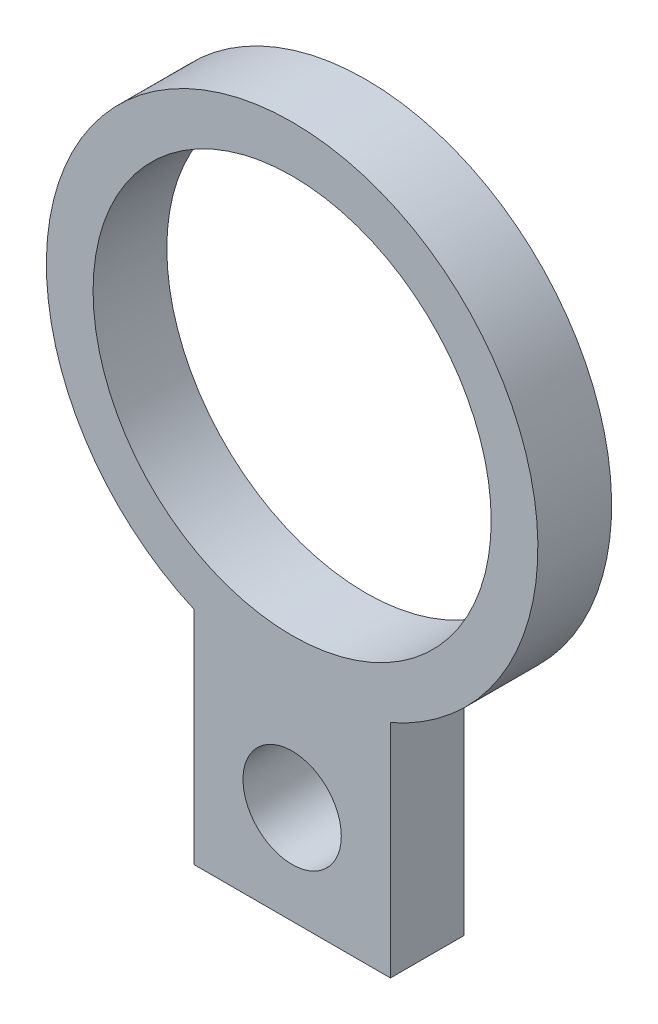
ISO-10303-21;
HEADER;
FILE_DESCRIPTION(('STEP AP214'),'2;1');
FILE_NAME('part.step','',(''),(''),'','','');
FILE_SCHEMA(('AUTOMOTIVE_DESIGN { 1 0 10303 214 1 1 1 1 }'));
ENDSEC;
DATA;
#1=APPLICATION_CONTEXT('core data for automotive mechanical design processes');
#2=APPLICATION_PROTOCOL_DEFINITION('international standard','automotive_design',2000,#1);
#3=PRODUCT_CONTEXT('',#1,'mechanical');
#4=PRODUCT('Part','Part','',(#3));
#5=PRODUCT_RELATED_PRODUCT_CATEGORY('part','',(#4));
#6=PRODUCT_DEFINITION_FORMATION('','',#4);
#7=PRODUCT_DEFINITION_CONTEXT('part definition',#1,'design');
#8=PRODUCT_DEFINITION('design','',#6,#7);
#9=PRODUCT_DEFINITION_SHAPE('','',#8);
#10=(LENGTH_UNIT() NAMED_UNIT(*) SI_UNIT(.MILLI.,.METRE.));
#11=(NAMED_UNIT(*) PLANE_ANGLE_UNIT() SI_UNIT($,.RADIAN.));
#12=(NAMED_UNIT(*) SI_UNIT($,.STERADIAN.) SOLID_ANGLE_UNIT());
#13=UNCERTAINTY_MEASURE_WITH_UNIT(LENGTH_MEASURE(1.E-05),#10,'distance_accuracy_value','');
#14=(GEOMETRIC_REPRESENTATION_CONTEXT(3) GLOBAL_UNCERTAINTY_ASSIGNED_CONTEXT((#13)) GLOBAL_UNIT_ASSIGNED_CONTEXT((#10,
#11,#12)) REPRESENTATION_CONTEXT('',''));
#15=CARTESIAN_POINT('',(0.,0.,0.));
#16=DIRECTION('',(0.,0.,1.));
#17=DIRECTION('',(1.,0.,0.));
#18=AXIS2_PLACEMENT_3D('',#15,#16,#17);
#19=CARTESIAN_POINT('',(0.,0.,1.5));
#20=DIRECTION('',(0.,0.,1.));
#21=DIRECTION('',(1.,0.,0.));
#22=AXIS2_PLACEMENT_3D('',#19,#20,#21);
#23=PLANE('',#22);
#24=CARTESIAN_POINT('',(0.,0.,1.5));
#25=DIRECTION('',(0.,0.,1.));
#26=DIRECTION('',(1.,0.,0.));
#27=AXIS2_PLACEMENT_3D('',#24,#25,#26);
#28=CIRCLE('',#27,4.05);
#29=CARTESIAN_POINT('',(4.05,0.,1.5));
#30=VERTEX_POINT('',#29);
#31=EDGE_CURVE('E112',#30,#30,#28,.T.);
#32=ORIENTED_EDGE('',*,*,#31,.F.);
#33=EDGE_LOOP('',(#32));
#34=FACE_BOUND('',#33,.T.);
#35=DIRECTION('',(0.,1.,0.));
#36=VECTOR('',#35,1.);
#37=CARTESIAN_POINT('',(2.,-9.08257569495584,1.5));
#38=LINE('',#37,#36);
#39=CARTESIAN_POINT('',(2.,-9.08257569495584,1.5));
#40=VERTEX_POINT('',#39);
#41=CARTESIAN_POINT('',(2.,-4.58257569495584,1.5));
#42=VERTEX_POINT('',#41);
#43=EDGE_CURVE('E92',#40,#42,#38,.T.);
#44=ORIENTED_EDGE('',*,*,#43,.T.);
#45=CARTESIAN_POINT('',(0.,0.,1.5));
#46=DIRECTION('',(0.,0.,1.));
#47=DIRECTION('',(1.,0.,0.));
#48=AXIS2_PLACEMENT_3D('',#45,#46,#47);
#49=CIRCLE('',#48,5.);
#50=CARTESIAN_POINT('',(-2.,-4.58257569495584,1.5));
#51=VERTEX_POINT('',#50);
#52=EDGE_CURVE('E87',#42,#51,#49,.T.);
#53=ORIENTED_EDGE('',*,*,#52,.T.);
#54=DIRECTION('',(0.,-1.,0.));
#55=VECTOR('',#54,1.);
#56=CARTESIAN_POINT('',(-2.,-4.58257569495584,1.5));
#57=LINE('',#56,#55);
#58=CARTESIAN_POINT('',(-2.,-9.08257569495584,1.5));
#59=VERTEX_POINT('',#58);
#60=EDGE_CURVE('E90',#51,#59,#57,.T.);
#61=ORIENTED_EDGE('',*,*,#60,.T.);
#62=DIRECTION('',(1.,0.,0.));
#63=VECTOR('',#62,1.);
#64=CARTESIAN_POINT('',(-2.,-9.08257569495584,1.5));
#65=LINE('',#64,#63);
#66=EDGE_CURVE('E57',#59,#40,#65,.T.);
#67=ORIENTED_EDGE('',*,*,#66,.T.);
#68=EDGE_LOOP('',(#44,#53,#61,#67));
#69=FACE_BOUND('',#68,.T.);
#70=CARTESIAN_POINT('',(0.,-7.08257569495584,1.5));
#71=DIRECTION('',(0.,0.,1.));
#72=DIRECTION('',(1.,0.,0.));
#73=AXIS2_PLACEMENT_3D('',#70,#71,#72);
#74=CIRCLE('',#73,1.);
#75=CARTESIAN_POINT('',(1.,-7.08257569495584,1.5));
#76=VERTEX_POINT('',#75);
#77=EDGE_CURVE('E134',#76,#76,#74,.T.);
#78=ORIENTED_EDGE('',*,*,#77,.F.);
#79=EDGE_LOOP('',(#78));
#80=FACE_BOUND('',#79,.T.);
#81=ADVANCED_FACE('F39',(#34,#69,#80),#23,.T.);
#82=CARTESIAN_POINT('',(0.,0.,0.));
#83=DIRECTION('',(0.,0.,1.));
#84=DIRECTION('',(1.,0.,0.));
#85=AXIS2_PLACEMENT_3D('',#82,#83,#84);
#86=PLANE('',#85);
#87=DIRECTION('',(0.,1.,0.));
#88=VECTOR('',#87,1.);
#89=CARTESIAN_POINT('',(2.,-9.08257569495584,0.));
#90=LINE('',#89,#88);
#91=CARTESIAN_POINT('',(2.,-9.08257569495584,0.));
#92=VERTEX_POINT('',#91);
#93=CARTESIAN_POINT('',(2.,-4.58257569495584,0.));
#94=VERTEX_POINT('',#93);
#95=EDGE_CURVE('E108',#92,#94,#90,.T.);
#96=ORIENTED_EDGE('',*,*,#95,.F.);
#97=DIRECTION('',(1.,0.,0.));
#98=VECTOR('',#97,1.);
#99=CARTESIAN_POINT('',(-2.,-9.08257569495584,0.));
#100=LINE('',#99,#98);
#101=CARTESIAN_POINT('',(-2.,-9.08257569495584,0.));
#102=VERTEX_POINT('',#101);
#103=EDGE_CURVE('E80',#102,#92,#100,.T.);
#104=ORIENTED_EDGE('',*,*,#103,.F.);
#105=DIRECTION('',(0.,-1.,0.));
#106=VECTOR('',#105,1.);
#107=CARTESIAN_POINT('',(-2.,-4.58257569495584,0.));
#108=LINE('',#107,#106);
#109=CARTESIAN_POINT('',(-2.,-4.58257569495584,0.));
#110=VERTEX_POINT('',#109);
#111=EDGE_CURVE('E74',#110,#102,#108,.T.);
#112=ORIENTED_EDGE('',*,*,#111,.F.);
#113=CARTESIAN_POINT('',(0.,0.,0.));
#114=DIRECTION('',(0.,0.,1.));
#115=DIRECTION('',(1.,0.,0.));
#116=AXIS2_PLACEMENT_3D('',#113,#114,#115);
#117=CIRCLE('',#116,5.);
#118=EDGE_CURVE('E97',#94,#110,#117,.T.);
#119=ORIENTED_EDGE('',*,*,#118,.F.);
#120=EDGE_LOOP('',(#96,#104,#112,#119));
#121=FACE_BOUND('',#120,.T.);
#122=CARTESIAN_POINT('',(0.,0.,0.));
#123=DIRECTION('',(0.,0.,1.));
#124=DIRECTION('',(1.,0.,0.));
#125=AXIS2_PLACEMENT_3D('',#122,#123,#124);
#126=CIRCLE('',#125,4.05);
#127=CARTESIAN_POINT('',(4.05,0.,0.));
#128=VERTEX_POINT('',#127);
#129=EDGE_CURVE('E130',#128,#128,#126,.T.);
#130=ORIENTED_EDGE('',*,*,#129,.T.);
#131=EDGE_LOOP('',(#130));
#132=FACE_BOUND('',#131,.T.);
#133=CARTESIAN_POINT('',(0.,-7.08257569495584,0.));
#134=DIRECTION('',(0.,0.,1.));
#135=DIRECTION('',(1.,0.,0.));
#136=AXIS2_PLACEMENT_3D('',#133,#134,#135);
#137=CIRCLE('',#136,1.);
#138=CARTESIAN_POINT('',(1.,-7.08257569495584,0.));
#139=VERTEX_POINT('',#138);
#140=EDGE_CURVE('E138',#139,#139,#137,.T.);
#141=ORIENTED_EDGE('',*,*,#140,.T.);
#142=EDGE_LOOP('',(#141));
#143=FACE_BOUND('',#142,.T.);
#144=ADVANCED_FACE('F125',(#121,#132,#143),#86,.F.);
#145=CARTESIAN_POINT('',(2.,-9.08257569495584,1.5));
#146=DIRECTION('',(-1.,0.,0.));
#147=DIRECTION('',(0.,0.,1.));
#148=AXIS2_PLACEMENT_3D('',#145,#146,#147);
#149=PLANE('',#148);
#150=ORIENTED_EDGE('',*,*,#95,.T.);
#151=DIRECTION('',(0.,0.,-1.));
#152=VECTOR('',#151,1.);
#153=CARTESIAN_POINT('',(2.,-4.58257569495584,1.5));
#154=LINE('',#153,#152);
#155=EDGE_CURVE('E11',#42,#94,#154,.T.);
#156=ORIENTED_EDGE('',*,*,#155,.F.);
#157=ORIENTED_EDGE('',*,*,#43,.F.);
#158=DIRECTION('',(0.,0.,-1.));
#159=VECTOR('',#158,1.);
#160=CARTESIAN_POINT('',(2.,-9.08257569495584,1.5));
#161=LINE('',#160,#159);
#162=EDGE_CURVE('E104',#40,#92,#161,.T.);
#163=ORIENTED_EDGE('',*,*,#162,.T.);
#164=EDGE_LOOP('',(#150,#156,#157,#163));
#165=FACE_BOUND('',#164,.T.);
#166=ADVANCED_FACE('F41',(#165),#149,.F.);
#167=CARTESIAN_POINT('',(0.,0.,1.5));
#168=DIRECTION('',(0.,0.,-1.));
#169=DIRECTION('',(-1.,0.,0.));
#170=AXIS2_PLACEMENT_3D('',#167,#168,#169);
#171=CYLINDRICAL_SURFACE('',#170,5.);
#172=ORIENTED_EDGE('',*,*,#118,.T.);
#173=DIRECTION('',(0.,0.,-1.));
#174=VECTOR('',#173,1.);
#175=CARTESIAN_POINT('',(-2.,-4.58257569495584,1.5));
#176=LINE('',#175,#174);
#177=EDGE_CURVE('E49',#51,#110,#176,.T.);
#178=ORIENTED_EDGE('',*,*,#177,.F.);
#179=ORIENTED_EDGE('',*,*,#52,.F.);
#180=ORIENTED_EDGE('',*,*,#155,.T.);
#181=EDGE_LOOP('',(#172,#178,#179,#180));
#182=FACE_BOUND('',#181,.T.);
#183=ADVANCED_FACE('F96',(#182),#171,.T.);
#184=CARTESIAN_POINT('',(-2.,-4.58257569495584,1.5));
#185=DIRECTION('',(1.,0.,0.));
#186=DIRECTION('',(0.,1.,0.));
#187=AXIS2_PLACEMENT_3D('',#184,#185,#186);
#188=PLANE('',#187);
#189=ORIENTED_EDGE('',*,*,#111,.T.);
#190=DIRECTION('',(0.,0.,-1.));
#191=VECTOR('',#190,1.);
#192=CARTESIAN_POINT('',(-2.,-9.08257569495584,1.5));
#193=LINE('',#192,#191);
#194=EDGE_CURVE('E99',#59,#102,#193,.T.);
#195=ORIENTED_EDGE('',*,*,#194,.F.);
#196=ORIENTED_EDGE('',*,*,#60,.F.);
#197=ORIENTED_EDGE('',*,*,#177,.T.);
#198=EDGE_LOOP('',(#189,#195,#196,#197));
#199=FACE_BOUND('',#198,.T.);
#200=ADVANCED_FACE('F100',(#199),#188,.F.);
#201=CARTESIAN_POINT('',(-2.,-9.08257569495584,1.5));
#202=DIRECTION('',(0.,1.,0.));
#203=DIRECTION('',(-1.,0.,0.));
#204=AXIS2_PLACEMENT_3D('',#201,#202,#203);
#205=PLANE('',#204);
#206=ORIENTED_EDGE('',*,*,#103,.T.);
#207=ORIENTED_EDGE('',*,*,#162,.F.);
#208=ORIENTED_EDGE('',*,*,#66,.F.);
#209=ORIENTED_EDGE('',*,*,#194,.T.);
#210=EDGE_LOOP('',(#206,#207,#208,#209));
#211=FACE_BOUND('',#210,.T.);
#212=ADVANCED_FACE('F122',(#211),#205,.F.);
#213=CARTESIAN_POINT('',(0.,0.,1.5));
#214=DIRECTION('',(0.,0.,-1.));
#215=DIRECTION('',(-1.,0.,0.));
#216=AXIS2_PLACEMENT_3D('',#213,#214,#215);
#217=CYLINDRICAL_SURFACE('',#216,4.05);
#218=ORIENTED_EDGE('',*,*,#31,.T.);
#219=EDGE_LOOP('',(#218));
#220=FACE_BOUND('',#219,.T.);
#221=ORIENTED_EDGE('',*,*,#129,.F.);
#222=EDGE_LOOP('',(#221));
#223=FACE_BOUND('',#222,.T.);
#224=ADVANCED_FACE('F157',(#220,#223),#217,.F.);
#225=CARTESIAN_POINT('',(0.,-7.08257569495584,1.5));
#226=DIRECTION('',(0.,0.,-1.));
#227=DIRECTION('',(-1.,0.,0.));
#228=AXIS2_PLACEMENT_3D('',#225,#226,#227);
#229=CYLINDRICAL_SURFACE('',#228,1.);
#230=ORIENTED_EDGE('',*,*,#77,.T.);
#231=EDGE_LOOP('',(#230));
#232=FACE_BOUND('',#231,.T.);
#233=ORIENTED_EDGE('',*,*,#140,.F.);
#234=EDGE_LOOP('',(#233));
#235=FACE_BOUND('',#234,.T.);
#236=ADVANCED_FACE('F146',(#232,#235),#229,.F.);
#237=CLOSED_SHELL('',(#81,#144,#166,#183,#200,#212,#224,#236));
#238=MANIFOLD_SOLID_BREP('B2',#237);
#239=ADVANCED_BREP_SHAPE_REPRESENTATION('',(#18,#238),#14);
#240=SHAPE_DEFINITION_REPRESENTATION(#9,#239);
ENDSEC;
END-ISO-10303-21;
